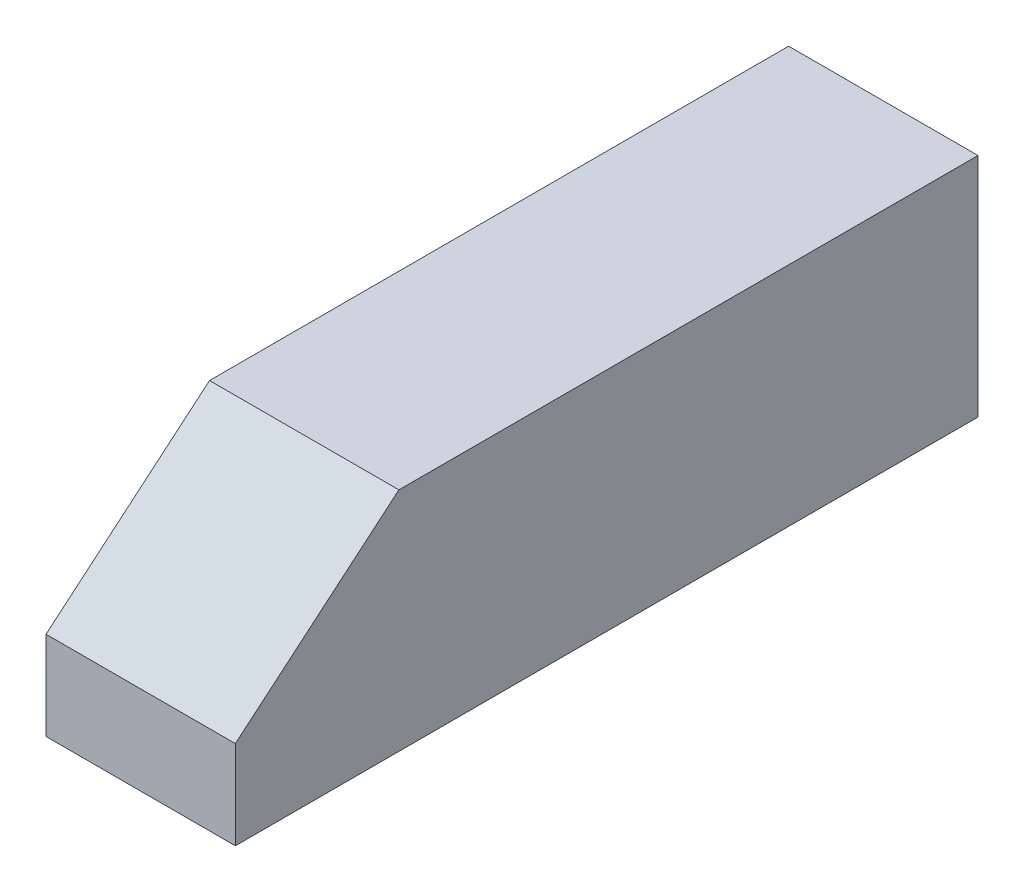
ISO-10303-21;
HEADER;
FILE_DESCRIPTION(('STEP AP214'),'2;1');
FILE_NAME('part.step','',(''),(''),'','','');
FILE_SCHEMA(('AUTOMOTIVE_DESIGN { 1 0 10303 214 1 1 1 1 }'));
ENDSEC;
DATA;
#1=APPLICATION_CONTEXT('core data for automotive mechanical design processes');
#2=APPLICATION_PROTOCOL_DEFINITION('international standard','automotive_design',2000,#1);
#3=PRODUCT_CONTEXT('',#1,'mechanical');
#4=PRODUCT('Part','Part','',(#3));
#5=PRODUCT_RELATED_PRODUCT_CATEGORY('part','',(#4));
#6=PRODUCT_DEFINITION_FORMATION('','',#4);
#7=PRODUCT_DEFINITION_CONTEXT('part definition',#1,'design');
#8=PRODUCT_DEFINITION('design','',#6,#7);
#9=PRODUCT_DEFINITION_SHAPE('','',#8);
#10=(LENGTH_UNIT() NAMED_UNIT(*) SI_UNIT(.MILLI.,.METRE.));
#11=(NAMED_UNIT(*) PLANE_ANGLE_UNIT() SI_UNIT($,.RADIAN.));
#12=(NAMED_UNIT(*) SI_UNIT($,.STERADIAN.) SOLID_ANGLE_UNIT());
#13=UNCERTAINTY_MEASURE_WITH_UNIT(LENGTH_MEASURE(1.E-05),#10,'distance_accuracy_value','');
#14=(GEOMETRIC_REPRESENTATION_CONTEXT(3) GLOBAL_UNCERTAINTY_ASSIGNED_CONTEXT((#13)) GLOBAL_UNIT_ASSIGNED_CONTEXT((#10,
#11,#12)) REPRESENTATION_CONTEXT('',''));
#15=CARTESIAN_POINT('',(0.,0.,0.));
#16=DIRECTION('',(0.,0.,1.));
#17=DIRECTION('',(1.,0.,0.));
#18=AXIS2_PLACEMENT_3D('',#15,#16,#17);
#19=CARTESIAN_POINT('',(-9.33559322033898,7.00169491525424,40.));
#20=DIRECTION('',(1.,0.,0.));
#21=DIRECTION('',(0.,1.,0.));
#22=AXIS2_PLACEMENT_3D('',#19,#20,#21);
#23=PLANE('',#22);
#24=DIRECTION('',(0.,-1.,0.));
#25=VECTOR('',#24,1.);
#26=CARTESIAN_POINT('',(-9.33559322033898,7.00169491525424,40.));
#27=LINE('',#26,#25);
#28=CARTESIAN_POINT('',(-9.33559322033898,-0.429227244486608,40.));
#29=VERTEX_POINT('',#28);
#30=CARTESIAN_POINT('',(-9.33559322033898,-5.19830508474576,40.));
#31=VERTEX_POINT('',#30);
#32=EDGE_CURVE('E105',#29,#31,#27,.T.);
#33=ORIENTED_EDGE('',*,*,#32,.F.);
#34=DIRECTION('',(0.,0.644827548614742,-0.764328092214007));
#35=VECTOR('',#34,1.);
#36=CARTESIAN_POINT('',(-9.33559322033898,2.66056926807329,36.33759711593));
#37=LINE('',#36,#35);
#38=CARTESIAN_POINT('',(-9.33559322033899,7.00169491525424,31.1919666429468));
#39=VERTEX_POINT('',#38);
#40=EDGE_CURVE('E57',#29,#39,#37,.T.);
#41=ORIENTED_EDGE('',*,*,#40,.T.);
#42=DIRECTION('',(0.,0.,-1.));
#43=VECTOR('',#42,1.);
#44=CARTESIAN_POINT('',(-9.33559322033898,7.00169491525424,40.));
#45=LINE('',#44,#43);
#46=CARTESIAN_POINT('',(-9.33559322033898,7.00169491525424,0.));
#47=VERTEX_POINT('',#46);
#48=EDGE_CURVE('E85',#39,#47,#45,.T.);
#49=ORIENTED_EDGE('',*,*,#48,.T.);
#50=DIRECTION('',(0.,-1.,0.));
#51=VECTOR('',#50,1.);
#52=CARTESIAN_POINT('',(-9.33559322033898,7.00169491525424,0.));
#53=LINE('',#52,#51);
#54=CARTESIAN_POINT('',(-9.33559322033898,-5.19830508474576,0.));
#55=VERTEX_POINT('',#54);
#56=EDGE_CURVE('E90',#47,#55,#53,.T.);
#57=ORIENTED_EDGE('',*,*,#56,.T.);
#58=DIRECTION('',(0.,0.,-1.));
#59=VECTOR('',#58,1.);
#60=CARTESIAN_POINT('',(-9.33559322033898,-5.19830508474576,40.));
#61=LINE('',#60,#59);
#62=EDGE_CURVE('E51',#31,#55,#61,.T.);
#63=ORIENTED_EDGE('',*,*,#62,.F.);
#64=EDGE_LOOP('',(#33,#41,#49,#57,#63));
#65=FACE_BOUND('',#64,.T.);
#66=ADVANCED_FACE('F43',(#65),#23,.F.);
#67=CARTESIAN_POINT('',(-9.33559322033898,-5.19830508474576,40.));
#68=DIRECTION('',(0.,1.,0.));
#69=DIRECTION('',(0.,0.,1.));
#70=AXIS2_PLACEMENT_3D('',#67,#68,#69);
#71=PLANE('',#70);
#72=DIRECTION('',(1.,0.,0.));
#73=VECTOR('',#72,1.);
#74=CARTESIAN_POINT('',(-9.33559322033898,-5.19830508474576,0.));
#75=LINE('',#74,#73);
#76=CARTESIAN_POINT('',(0.864406779661018,-5.19830508474576,0.));
#77=VERTEX_POINT('',#76);
#78=EDGE_CURVE('E109',#55,#77,#75,.T.);
#79=ORIENTED_EDGE('',*,*,#78,.T.);
#80=DIRECTION('',(0.,0.,-1.));
#81=VECTOR('',#80,1.);
#82=CARTESIAN_POINT('',(0.864406779661018,-5.19830508474576,40.));
#83=LINE('',#82,#81);
#84=CARTESIAN_POINT('',(0.864406779661018,-5.19830508474576,40.));
#85=VERTEX_POINT('',#84);
#86=EDGE_CURVE('E125',#85,#77,#83,.T.);
#87=ORIENTED_EDGE('',*,*,#86,.F.);
#88=DIRECTION('',(1.,0.,0.));
#89=VECTOR('',#88,1.);
#90=CARTESIAN_POINT('',(-9.33559322033898,-5.19830508474576,40.));
#91=LINE('',#90,#89);
#92=EDGE_CURVE('E66',#31,#85,#91,.T.);
#93=ORIENTED_EDGE('',*,*,#92,.F.);
#94=ORIENTED_EDGE('',*,*,#62,.T.);
#95=EDGE_LOOP('',(#79,#87,#93,#94));
#96=FACE_BOUND('',#95,.T.);
#97=ADVANCED_FACE('F130',(#96),#71,.F.);
#98=CARTESIAN_POINT('',(0.864406779661017,7.00169491525424,40.));
#99=DIRECTION('',(-1.,0.,0.));
#100=DIRECTION('',(0.,-1.,0.));
#101=AXIS2_PLACEMENT_3D('',#98,#99,#100);
#102=PLANE('',#101);
#103=DIRECTION('',(0.,0.,-1.));
#104=VECTOR('',#103,1.);
#105=CARTESIAN_POINT('',(0.864406779661017,7.00169491525424,40.));
#106=LINE('',#105,#104);
#107=CARTESIAN_POINT('',(0.864406779661017,7.00169491525424,31.1919666429468));
#108=VERTEX_POINT('',#107);
#109=CARTESIAN_POINT('',(0.864406779661017,7.00169491525424,0.));
#110=VERTEX_POINT('',#109);
#111=EDGE_CURVE('E94',#108,#110,#106,.T.);
#112=ORIENTED_EDGE('',*,*,#111,.F.);
#113=DIRECTION('',(0.,0.644827548614742,-0.764328092214006));
#114=VECTOR('',#113,1.);
#115=CARTESIAN_POINT('',(0.864406779661017,-0.429227244486607,40.));
#116=LINE('',#115,#114);
#117=CARTESIAN_POINT('',(0.864406779661017,-0.429227244486607,40.));
#118=VERTEX_POINT('',#117);
#119=EDGE_CURVE('E137',#118,#108,#116,.T.);
#120=ORIENTED_EDGE('',*,*,#119,.F.);
#121=DIRECTION('',(0.,1.,0.));
#122=VECTOR('',#121,1.);
#123=CARTESIAN_POINT('',(0.864406779661017,7.00169491525424,40.));
#124=LINE('',#123,#122);
#125=EDGE_CURVE('E95',#85,#118,#124,.T.);
#126=ORIENTED_EDGE('',*,*,#125,.F.);
#127=ORIENTED_EDGE('',*,*,#86,.T.);
#128=DIRECTION('',(0.,1.,0.));
#129=VECTOR('',#128,1.);
#130=CARTESIAN_POINT('',(0.864406779661017,7.00169491525424,0.));
#131=LINE('',#130,#129);
#132=EDGE_CURVE('E106',#77,#110,#131,.T.);
#133=ORIENTED_EDGE('',*,*,#132,.T.);
#134=EDGE_LOOP('',(#112,#120,#126,#127,#133));
#135=FACE_BOUND('',#134,.T.);
#136=ADVANCED_FACE('F147',(#135),#102,.F.);
#137=CARTESIAN_POINT('',(-9.33559322033898,7.00169491525424,40.));
#138=DIRECTION('',(0.,-1.,0.));
#139=DIRECTION('',(0.,0.,-1.));
#140=AXIS2_PLACEMENT_3D('',#137,#138,#139);
#141=PLANE('',#140);
#142=ORIENTED_EDGE('',*,*,#48,.F.);
#143=DIRECTION('',(1.,0.,0.));
#144=VECTOR('',#143,1.);
#145=CARTESIAN_POINT('',(-49.135593220339,7.00169491525423,31.1919666429468));
#146=LINE('',#145,#144);
#147=EDGE_CURVE('E116',#39,#108,#146,.T.);
#148=ORIENTED_EDGE('',*,*,#147,.T.);
#149=ORIENTED_EDGE('',*,*,#111,.T.);
#150=DIRECTION('',(-1.,0.,0.));
#151=VECTOR('',#150,1.);
#152=CARTESIAN_POINT('',(-9.33559322033898,7.00169491525424,0.));
#153=LINE('',#152,#151);
#154=EDGE_CURVE('E98',#110,#47,#153,.T.);
#155=ORIENTED_EDGE('',*,*,#154,.T.);
#156=EDGE_LOOP('',(#142,#148,#149,#155));
#157=FACE_BOUND('',#156,.T.);
#158=ADVANCED_FACE('F99',(#157),#141,.F.);
#159=CARTESIAN_POINT('',(0.,0.,40.));
#160=DIRECTION('',(0.,0.,1.));
#161=DIRECTION('',(1.,0.,0.));
#162=AXIS2_PLACEMENT_3D('',#159,#160,#161);
#163=PLANE('',#162);
#164=DIRECTION('',(1.,0.,0.));
#165=VECTOR('',#164,1.);
#166=CARTESIAN_POINT('',(0.,-0.429227244486607,40.));
#167=LINE('',#166,#165);
#168=EDGE_CURVE('E11',#29,#118,#167,.T.);
#169=ORIENTED_EDGE('',*,*,#168,.F.);
#170=ORIENTED_EDGE('',*,*,#32,.T.);
#171=ORIENTED_EDGE('',*,*,#92,.T.);
#172=ORIENTED_EDGE('',*,*,#125,.T.);
#173=EDGE_LOOP('',(#169,#170,#171,#172));
#174=FACE_BOUND('',#173,.T.);
#175=ADVANCED_FACE('F149',(#174),#163,.T.);
#176=CARTESIAN_POINT('',(0.,0.,0.));
#177=DIRECTION('',(0.,0.,1.));
#178=DIRECTION('',(1.,0.,0.));
#179=AXIS2_PLACEMENT_3D('',#176,#177,#178);
#180=PLANE('',#179);
#181=ORIENTED_EDGE('',*,*,#56,.F.);
#182=ORIENTED_EDGE('',*,*,#154,.F.);
#183=ORIENTED_EDGE('',*,*,#132,.F.);
#184=ORIENTED_EDGE('',*,*,#78,.F.);
#185=EDGE_LOOP('',(#181,#182,#183,#184));
#186=FACE_BOUND('',#185,.T.);
#187=ADVANCED_FACE('F108',(#186),#180,.F.);
#188=CARTESIAN_POINT('',(-49.135593220339,-0.429227244486613,40.));
#189=DIRECTION('',(0.,-0.764328092214006,-0.644827548614742));
#190=DIRECTION('',(0.,0.644827548614742,-0.764328092214007));
#191=AXIS2_PLACEMENT_3D('',#188,#189,#190);
#192=PLANE('',#191);
#193=ORIENTED_EDGE('',*,*,#168,.T.);
#194=ORIENTED_EDGE('',*,*,#119,.T.);
#195=ORIENTED_EDGE('',*,*,#147,.F.);
#196=ORIENTED_EDGE('',*,*,#40,.F.);
#197=EDGE_LOOP('',(#193,#194,#195,#196));
#198=FACE_BOUND('',#197,.T.);
#199=ADVANCED_FACE('F142',(#198),#192,.F.);
#200=CLOSED_SHELL('',(#66,#97,#136,#158,#175,#187,#199));
#201=MANIFOLD_SOLID_BREP('B2',#200);
#202=ADVANCED_BREP_SHAPE_REPRESENTATION('',(#18,#201),#14);
#203=SHAPE_DEFINITION_REPRESENTATION(#9,#202);
ENDSEC;
END-ISO-10303-21;
